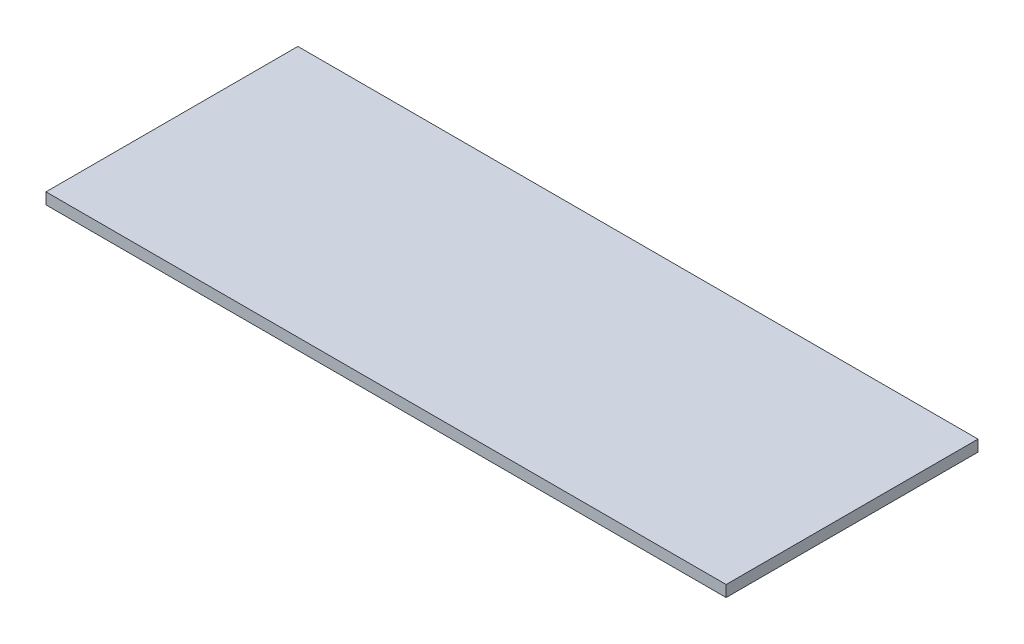
ISO-10303-21;
HEADER;
FILE_DESCRIPTION(('STEP AP214'),'2;1');
FILE_NAME('part.step','',(''),(''),'','','');
FILE_SCHEMA(('AUTOMOTIVE_DESIGN { 1 0 10303 214 1 1 1 1 }'));
ENDSEC;
DATA;
#1=APPLICATION_CONTEXT('core data for automotive mechanical design processes');
#2=APPLICATION_PROTOCOL_DEFINITION('international standard','automotive_design',2000,#1);
#3=PRODUCT_CONTEXT('',#1,'mechanical');
#4=PRODUCT('Part','Part','',(#3));
#5=PRODUCT_RELATED_PRODUCT_CATEGORY('part','',(#4));
#6=PRODUCT_DEFINITION_FORMATION('','',#4);
#7=PRODUCT_DEFINITION_CONTEXT('part definition',#1,'design');
#8=PRODUCT_DEFINITION('design','',#6,#7);
#9=PRODUCT_DEFINITION_SHAPE('','',#8);
#10=(LENGTH_UNIT() NAMED_UNIT(*) SI_UNIT(.MILLI.,.METRE.));
#11=(NAMED_UNIT(*) PLANE_ANGLE_UNIT() SI_UNIT($,.RADIAN.));
#12=(NAMED_UNIT(*) SI_UNIT($,.STERADIAN.) SOLID_ANGLE_UNIT());
#13=UNCERTAINTY_MEASURE_WITH_UNIT(LENGTH_MEASURE(1.E-05),#10,'distance_accuracy_value','');
#14=(GEOMETRIC_REPRESENTATION_CONTEXT(3) GLOBAL_UNCERTAINTY_ASSIGNED_CONTEXT((#13)) GLOBAL_UNIT_ASSIGNED_CONTEXT((#10,
#11,#12)) REPRESENTATION_CONTEXT('',''));
#15=CARTESIAN_POINT('',(0.,0.,0.));
#16=DIRECTION('',(0.,0.,1.));
#17=DIRECTION('',(1.,0.,0.));
#18=AXIS2_PLACEMENT_3D('',#15,#16,#17);
#19=CARTESIAN_POINT('',(76.2,2.54,-28.2194));
#20=DIRECTION('',(-1.,0.,0.));
#21=DIRECTION('',(0.,0.,1.));
#22=AXIS2_PLACEMENT_3D('',#19,#20,#21);
#23=PLANE('',#22);
#24=DIRECTION('',(0.,0.,-1.));
#25=VECTOR('',#24,1.);
#26=CARTESIAN_POINT('',(76.2,0.,-28.2194));
#27=LINE('',#26,#25);
#28=CARTESIAN_POINT('',(76.2,0.,28.2194));
#29=VERTEX_POINT('',#28);
#30=CARTESIAN_POINT('',(76.2,0.,-28.2194));
#31=VERTEX_POINT('',#30);
#32=EDGE_CURVE('E96',#29,#31,#27,.T.);
#33=ORIENTED_EDGE('',*,*,#32,.T.);
#34=DIRECTION('',(0.,-1.,0.));
#35=VECTOR('',#34,1.);
#36=CARTESIAN_POINT('',(76.2,2.54,-28.2194));
#37=LINE('',#36,#35);
#38=CARTESIAN_POINT('',(76.2,2.54,-28.2194));
#39=VERTEX_POINT('',#38);
#40=EDGE_CURVE('E11',#39,#31,#37,.T.);
#41=ORIENTED_EDGE('',*,*,#40,.F.);
#42=DIRECTION('',(0.,0.,-1.));
#43=VECTOR('',#42,1.);
#44=CARTESIAN_POINT('',(76.2,2.54,-28.2194));
#45=LINE('',#44,#43);
#46=CARTESIAN_POINT('',(76.2,2.54,28.2194));
#47=VERTEX_POINT('',#46);
#48=EDGE_CURVE('E84',#47,#39,#45,.T.);
#49=ORIENTED_EDGE('',*,*,#48,.F.);
#50=DIRECTION('',(0.,-1.,0.));
#51=VECTOR('',#50,1.);
#52=CARTESIAN_POINT('',(76.2,2.54,28.2194));
#53=LINE('',#52,#51);
#54=EDGE_CURVE('E92',#47,#29,#53,.T.);
#55=ORIENTED_EDGE('',*,*,#54,.T.);
#56=EDGE_LOOP('',(#33,#41,#49,#55));
#57=FACE_BOUND('',#56,.T.);
#58=ADVANCED_FACE('F33',(#57),#23,.F.);
#59=CARTESIAN_POINT('',(-76.2,2.54,-28.2194));
#60=DIRECTION('',(0.,0.,1.));
#61=DIRECTION('',(1.,0.,0.));
#62=AXIS2_PLACEMENT_3D('',#59,#60,#61);
#63=PLANE('',#62);
#64=DIRECTION('',(-1.,0.,0.));
#65=VECTOR('',#64,1.);
#66=CARTESIAN_POINT('',(-76.2,0.,-28.2194));
#67=LINE('',#66,#65);
#68=CARTESIAN_POINT('',(-76.2,0.,-28.2194));
#69=VERTEX_POINT('',#68);
#70=EDGE_CURVE('E88',#31,#69,#67,.T.);
#71=ORIENTED_EDGE('',*,*,#70,.T.);
#72=DIRECTION('',(0.,-1.,0.));
#73=VECTOR('',#72,1.);
#74=CARTESIAN_POINT('',(-76.2,2.54,-28.2194));
#75=LINE('',#74,#73);
#76=CARTESIAN_POINT('',(-76.2,2.54,-28.2194));
#77=VERTEX_POINT('',#76);
#78=EDGE_CURVE('E41',#77,#69,#75,.T.);
#79=ORIENTED_EDGE('',*,*,#78,.F.);
#80=DIRECTION('',(-1.,0.,0.));
#81=VECTOR('',#80,1.);
#82=CARTESIAN_POINT('',(-76.2,2.54,-28.2194));
#83=LINE('',#82,#81);
#84=EDGE_CURVE('E79',#39,#77,#83,.T.);
#85=ORIENTED_EDGE('',*,*,#84,.F.);
#86=ORIENTED_EDGE('',*,*,#40,.T.);
#87=EDGE_LOOP('',(#71,#79,#85,#86));
#88=FACE_BOUND('',#87,.T.);
#89=ADVANCED_FACE('F87',(#88),#63,.F.);
#90=CARTESIAN_POINT('',(-76.2,2.54,-28.2194));
#91=DIRECTION('',(1.,0.,0.));
#92=DIRECTION('',(0.,0.,-1.));
#93=AXIS2_PLACEMENT_3D('',#90,#91,#92);
#94=PLANE('',#93);
#95=DIRECTION('',(0.,0.,1.));
#96=VECTOR('',#95,1.);
#97=CARTESIAN_POINT('',(-76.2,0.,-28.2194));
#98=LINE('',#97,#96);
#99=CARTESIAN_POINT('',(-76.2,0.,28.2194));
#100=VERTEX_POINT('',#99);
#101=EDGE_CURVE('E66',#69,#100,#98,.T.);
#102=ORIENTED_EDGE('',*,*,#101,.T.);
#103=DIRECTION('',(0.,-1.,0.));
#104=VECTOR('',#103,1.);
#105=CARTESIAN_POINT('',(-76.2,2.54,28.2194));
#106=LINE('',#105,#104);
#107=CARTESIAN_POINT('',(-76.2,2.54,28.2194));
#108=VERTEX_POINT('',#107);
#109=EDGE_CURVE('E89',#108,#100,#106,.T.);
#110=ORIENTED_EDGE('',*,*,#109,.F.);
#111=DIRECTION('',(0.,0.,1.));
#112=VECTOR('',#111,1.);
#113=CARTESIAN_POINT('',(-76.2,2.54,-28.2194));
#114=LINE('',#113,#112);
#115=EDGE_CURVE('E82',#77,#108,#114,.T.);
#116=ORIENTED_EDGE('',*,*,#115,.F.);
#117=ORIENTED_EDGE('',*,*,#78,.T.);
#118=EDGE_LOOP('',(#102,#110,#116,#117));
#119=FACE_BOUND('',#118,.T.);
#120=ADVANCED_FACE('F90',(#119),#94,.F.);
#121=CARTESIAN_POINT('',(-76.2,2.54,28.2194));
#122=DIRECTION('',(0.,0.,-1.));
#123=DIRECTION('',(-1.,0.,0.));
#124=AXIS2_PLACEMENT_3D('',#121,#122,#123);
#125=PLANE('',#124);
#126=DIRECTION('',(1.,0.,0.));
#127=VECTOR('',#126,1.);
#128=CARTESIAN_POINT('',(-76.2,0.,28.2194));
#129=LINE('',#128,#127);
#130=EDGE_CURVE('E72',#100,#29,#129,.T.);
#131=ORIENTED_EDGE('',*,*,#130,.T.);
#132=ORIENTED_EDGE('',*,*,#54,.F.);
#133=DIRECTION('',(1.,0.,0.));
#134=VECTOR('',#133,1.);
#135=CARTESIAN_POINT('',(-76.2,2.54,28.2194));
#136=LINE('',#135,#134);
#137=EDGE_CURVE('E49',#108,#47,#136,.T.);
#138=ORIENTED_EDGE('',*,*,#137,.F.);
#139=ORIENTED_EDGE('',*,*,#109,.T.);
#140=EDGE_LOOP('',(#131,#132,#138,#139));
#141=FACE_BOUND('',#140,.T.);
#142=ADVANCED_FACE('F103',(#141),#125,.F.);
#143=CARTESIAN_POINT('',(0.,2.54,0.));
#144=DIRECTION('',(0.,1.,0.));
#145=DIRECTION('',(0.,0.,1.));
#146=AXIS2_PLACEMENT_3D('',#143,#144,#145);
#147=PLANE('',#146);
#148=ORIENTED_EDGE('',*,*,#48,.T.);
#149=ORIENTED_EDGE('',*,*,#84,.T.);
#150=ORIENTED_EDGE('',*,*,#115,.T.);
#151=ORIENTED_EDGE('',*,*,#137,.T.);
#152=EDGE_LOOP('',(#148,#149,#150,#151));
#153=FACE_BOUND('',#152,.T.);
#154=ADVANCED_FACE('F80',(#153),#147,.T.);
#155=CARTESIAN_POINT('',(0.,0.,0.));
#156=DIRECTION('',(0.,1.,0.));
#157=DIRECTION('',(0.,0.,1.));
#158=AXIS2_PLACEMENT_3D('',#155,#156,#157);
#159=PLANE('',#158);
#160=ORIENTED_EDGE('',*,*,#32,.F.);
#161=ORIENTED_EDGE('',*,*,#130,.F.);
#162=ORIENTED_EDGE('',*,*,#101,.F.);
#163=ORIENTED_EDGE('',*,*,#70,.F.);
#164=EDGE_LOOP('',(#160,#161,#162,#163));
#165=FACE_BOUND('',#164,.T.);
#166=ADVANCED_FACE('F106',(#165),#159,.F.);
#167=CLOSED_SHELL('',(#58,#89,#120,#142,#154,#166));
#168=MANIFOLD_SOLID_BREP('B2',#167);
#169=ADVANCED_BREP_SHAPE_REPRESENTATION('',(#18,#168),#14);
#170=SHAPE_DEFINITION_REPRESENTATION(#9,#169);
ENDSEC;
END-ISO-10303-21;
